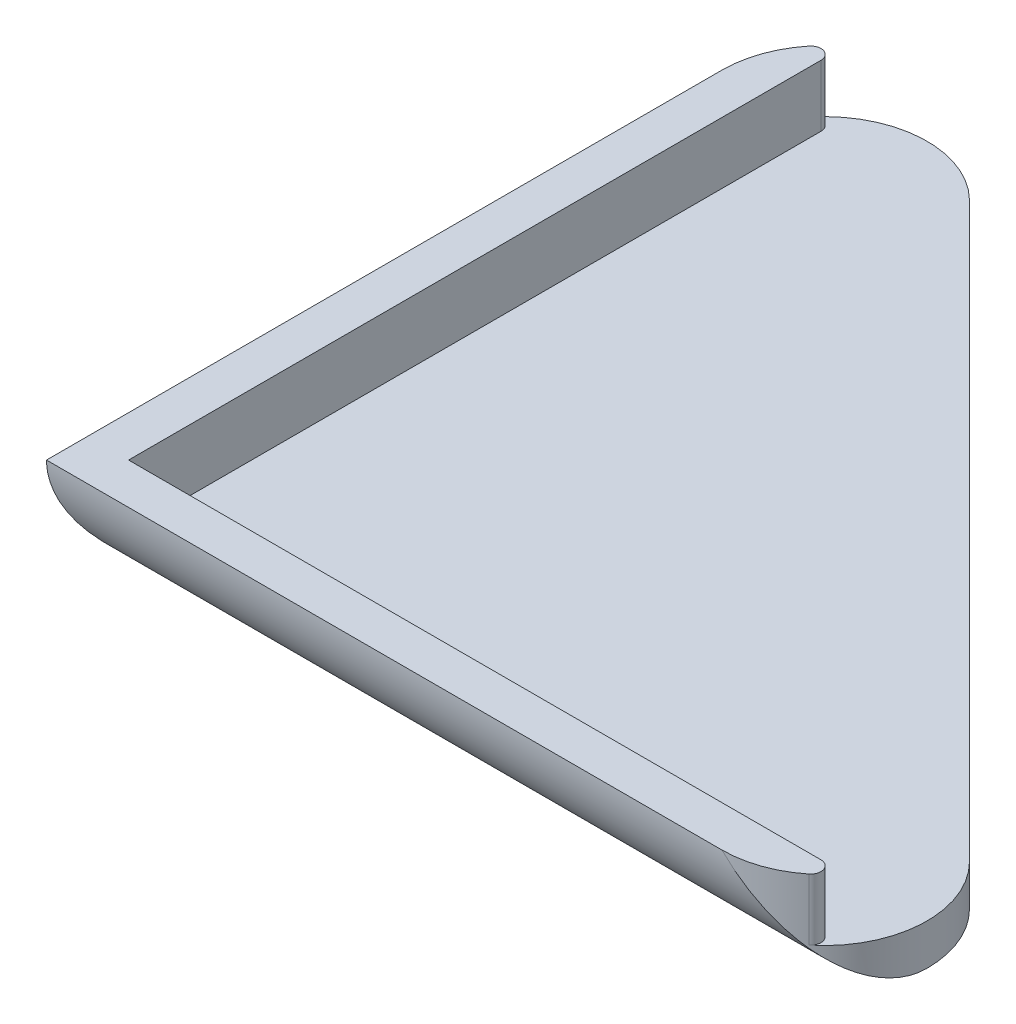
ISO-10303-21;
HEADER;
FILE_DESCRIPTION(('STEP AP214'),'2;1');
FILE_NAME('part.step','',(''),(''),'','','');
FILE_SCHEMA(('AUTOMOTIVE_DESIGN { 1 0 10303 214 1 1 1 1 }'));
ENDSEC;
DATA;
#1=APPLICATION_CONTEXT('core data for automotive mechanical design processes');
#2=APPLICATION_PROTOCOL_DEFINITION('international standard','automotive_design',2000,#1);
#3=PRODUCT_CONTEXT('',#1,'mechanical');
#4=PRODUCT('Part','Part','',(#3));
#5=PRODUCT_RELATED_PRODUCT_CATEGORY('part','',(#4));
#6=PRODUCT_DEFINITION_FORMATION('','',#4);
#7=PRODUCT_DEFINITION_CONTEXT('part definition',#1,'design');
#8=PRODUCT_DEFINITION('design','',#6,#7);
#9=PRODUCT_DEFINITION_SHAPE('','',#8);
#10=(LENGTH_UNIT() NAMED_UNIT(*) SI_UNIT(.MILLI.,.METRE.));
#11=(NAMED_UNIT(*) PLANE_ANGLE_UNIT() SI_UNIT($,.RADIAN.));
#12=(NAMED_UNIT(*) SI_UNIT($,.STERADIAN.) SOLID_ANGLE_UNIT());
#13=UNCERTAINTY_MEASURE_WITH_UNIT(LENGTH_MEASURE(1.E-05),#10,'distance_accuracy_value','');
#14=(GEOMETRIC_REPRESENTATION_CONTEXT(3) GLOBAL_UNCERTAINTY_ASSIGNED_CONTEXT((#13)) GLOBAL_UNIT_ASSIGNED_CONTEXT((#10,
#11,#12)) REPRESENTATION_CONTEXT('',''));
#15=CARTESIAN_POINT('',(0.,0.,0.));
#16=DIRECTION('',(0.,0.,1.));
#17=DIRECTION('',(1.,0.,0.));
#18=AXIS2_PLACEMENT_3D('',#15,#16,#17);
#19=CARTESIAN_POINT('',(0.,2.,0.));
#20=DIRECTION('',(0.,-1.,0.));
#21=DIRECTION('',(0.,0.,-1.));
#22=AXIS2_PLACEMENT_3D('',#19,#20,#21);
#23=PLANE('',#22);
#24=DIRECTION('',(-1.,0.,0.));
#25=VECTOR('',#24,1.);
#26=CARTESIAN_POINT('',(2.,2.,-2.));
#27=LINE('',#26,#25);
#28=CARTESIAN_POINT('',(35.7573593128807,2.,-2.));
#29=VERTEX_POINT('',#28);
#30=CARTESIAN_POINT('',(2.,2.,-2.));
#31=VERTEX_POINT('',#30);
#32=EDGE_CURVE('E142',#29,#31,#27,.T.);
#33=ORIENTED_EDGE('',*,*,#32,.F.);
#34=CARTESIAN_POINT('',(35.7573593128807,2.,-1.5));
#35=DIRECTION('',(0.,-1.,0.));
#36=DIRECTION('',(0.,0.,-1.));
#37=AXIS2_PLACEMENT_3D('',#34,#35,#36);
#38=CIRCLE('',#37,0.5);
#39=CARTESIAN_POINT('',(36.0716289934081,2.,-1.11111111111111));
#40=VERTEX_POINT('',#39);
#41=EDGE_CURVE('E11',#29,#40,#38,.T.);
#42=ORIENTED_EDGE('',*,*,#41,.T.);
#43=CARTESIAN_POINT('',(32.9289321881345,2.,-5.));
#44=DIRECTION('',(0.,-1.,0.));
#45=DIRECTION('',(0.,0.,-1.));
#46=AXIS2_PLACEMENT_3D('',#43,#44,#45);
#47=CIRCLE('',#46,5.);
#48=CARTESIAN_POINT('',(36.4644660940673,2.,-8.53553390593274));
#49=VERTEX_POINT('',#48);
#50=EDGE_CURVE('E51',#40,#49,#47,.F.);
#51=ORIENTED_EDGE('',*,*,#50,.T.);
#52=DIRECTION('',(-0.707106781186548,0.,-0.707106781186548));
#53=VECTOR('',#52,1.);
#54=CARTESIAN_POINT('',(0.,2.,-45.));
#55=LINE('',#54,#53);
#56=CARTESIAN_POINT('',(8.53553390593274,2.,-36.4644660940673));
#57=VERTEX_POINT('',#56);
#58=EDGE_CURVE('E153',#49,#57,#55,.T.);
#59=ORIENTED_EDGE('',*,*,#58,.T.);
#60=CARTESIAN_POINT('',(5.,2.,-32.9289321881345));
#61=DIRECTION('',(0.,-1.,0.));
#62=DIRECTION('',(0.,0.,-1.));
#63=AXIS2_PLACEMENT_3D('',#60,#61,#62);
#64=CIRCLE('',#63,5.);
#65=CARTESIAN_POINT('',(1.11111111111111,2.,-36.0716289934081));
#66=VERTEX_POINT('',#65);
#67=EDGE_CURVE('E172',#57,#66,#64,.F.);
#68=ORIENTED_EDGE('',*,*,#67,.T.);
#69=CARTESIAN_POINT('',(1.5,2.,-35.7573593128807));
#70=DIRECTION('',(0.,-1.,0.));
#71=DIRECTION('',(0.,0.,-1.));
#72=AXIS2_PLACEMENT_3D('',#69,#70,#71);
#73=CIRCLE('',#72,0.5);
#74=CARTESIAN_POINT('',(2.,2.,-35.7573593128807));
#75=VERTEX_POINT('',#74);
#76=EDGE_CURVE('E44',#66,#75,#73,.T.);
#77=ORIENTED_EDGE('',*,*,#76,.T.);
#78=DIRECTION('',(0.,0.,-1.));
#79=VECTOR('',#78,1.);
#80=CARTESIAN_POINT('',(2.,2.,-43.));
#81=LINE('',#80,#79);
#82=EDGE_CURVE('E139',#31,#75,#81,.T.);
#83=ORIENTED_EDGE('',*,*,#82,.F.);
#84=EDGE_LOOP('',(#33,#42,#51,#59,#68,#77,#83));
#85=FACE_BOUND('',#84,.T.);
#86=ADVANCED_FACE('F36',(#85),#23,.F.);
#87=CARTESIAN_POINT('',(0.,2.,-45.));
#88=DIRECTION('',(-0.707106781186547,0.,0.707106781186547));
#89=DIRECTION('',(0.707106781186548,0.,0.707106781186548));
#90=AXIS2_PLACEMENT_3D('',#87,#88,#89);
#91=PLANE('',#90);
#92=ORIENTED_EDGE('',*,*,#58,.F.);
#93=DIRECTION('',(0.,-1.,0.));
#94=VECTOR('',#93,1.);
#95=CARTESIAN_POINT('',(36.4644660940673,2.,-8.53553390593274));
#96=LINE('',#95,#94);
#97=CARTESIAN_POINT('',(36.4644660940673,0.,-8.53553390593274));
#98=VERTEX_POINT('',#97);
#99=EDGE_CURVE('E167',#49,#98,#96,.T.);
#100=ORIENTED_EDGE('',*,*,#99,.T.);
#101=DIRECTION('',(-0.707106781186548,0.,-0.707106781186548));
#102=VECTOR('',#101,1.);
#103=CARTESIAN_POINT('',(0.,0.,-45.));
#104=LINE('',#103,#102);
#105=CARTESIAN_POINT('',(8.53553390593274,0.,-36.4644660940673));
#106=VERTEX_POINT('',#105);
#107=EDGE_CURVE('E152',#98,#106,#104,.T.);
#108=ORIENTED_EDGE('',*,*,#107,.T.);
#109=DIRECTION('',(0.,-1.,0.));
#110=VECTOR('',#109,1.);
#111=CARTESIAN_POINT('',(8.53553390593273,2.,-36.4644660940673));
#112=LINE('',#111,#110);
#113=EDGE_CURVE('E165',#106,#57,#112,.F.);
#114=ORIENTED_EDGE('',*,*,#113,.T.);
#115=EDGE_LOOP('',(#92,#100,#108,#114));
#116=FACE_BOUND('',#115,.T.);
#117=ADVANCED_FACE('F213',(#116),#91,.F.);
#118=CARTESIAN_POINT('',(0.,0.,0.));
#119=DIRECTION('',(0.,-1.,0.));
#120=DIRECTION('',(0.,0.,-1.));
#121=AXIS2_PLACEMENT_3D('',#118,#119,#120);
#122=PLANE('',#121);
#123=ORIENTED_EDGE('',*,*,#107,.F.);
#124=CARTESIAN_POINT('',(32.9289321881345,0.,-5.));
#125=DIRECTION('',(0.,-1.,0.));
#126=DIRECTION('',(0.,0.,-1.));
#127=AXIS2_PLACEMENT_3D('',#124,#125,#126);
#128=CIRCLE('',#127,5.);
#129=CARTESIAN_POINT('',(37.9289321881345,0.,-5.));
#130=VERTEX_POINT('',#129);
#131=EDGE_CURVE('E163',#98,#130,#128,.T.);
#132=ORIENTED_EDGE('',*,*,#131,.T.);
#133=DIRECTION('',(1.,0.,0.));
#134=VECTOR('',#133,1.);
#135=CARTESIAN_POINT('',(0.,0.,-5.));
#136=LINE('',#135,#134);
#137=CARTESIAN_POINT('',(5.,0.,-5.));
#138=VERTEX_POINT('',#137);
#139=EDGE_CURVE('E161',#130,#138,#136,.F.);
#140=ORIENTED_EDGE('',*,*,#139,.T.);
#141=DIRECTION('',(0.,0.,1.));
#142=VECTOR('',#141,1.);
#143=CARTESIAN_POINT('',(5.,0.,-45.));
#144=LINE('',#143,#142);
#145=CARTESIAN_POINT('',(5.,0.,-37.9289321881345));
#146=VERTEX_POINT('',#145);
#147=EDGE_CURVE('E119',#138,#146,#144,.F.);
#148=ORIENTED_EDGE('',*,*,#147,.T.);
#149=CARTESIAN_POINT('',(5.,0.,-32.9289321881345));
#150=DIRECTION('',(0.,-1.,0.));
#151=DIRECTION('',(0.,0.,-1.));
#152=AXIS2_PLACEMENT_3D('',#149,#150,#151);
#153=CIRCLE('',#152,5.);
#154=EDGE_CURVE('E156',#146,#106,#153,.T.);
#155=ORIENTED_EDGE('',*,*,#154,.T.);
#156=EDGE_LOOP('',(#123,#132,#140,#148,#155));
#157=FACE_BOUND('',#156,.T.);
#158=ADVANCED_FACE('F209',(#157),#122,.T.);
#159=CARTESIAN_POINT('',(2.,5.,-2.));
#160=DIRECTION('',(0.,0.,1.));
#161=DIRECTION('',(1.,0.,0.));
#162=AXIS2_PLACEMENT_3D('',#159,#160,#161);
#163=PLANE('',#162);
#164=DIRECTION('',(-1.,0.,0.));
#165=VECTOR('',#164,1.);
#166=CARTESIAN_POINT('',(2.,5.,-2.));
#167=LINE('',#166,#165);
#168=CARTESIAN_POINT('',(35.7573593128807,5.,-2.));
#169=VERTEX_POINT('',#168);
#170=CARTESIAN_POINT('',(2.,5.,-2.));
#171=VERTEX_POINT('',#170);
#172=EDGE_CURVE('E132',#169,#171,#167,.T.);
#173=ORIENTED_EDGE('',*,*,#172,.F.);
#174=DIRECTION('',(0.,1.,0.));
#175=VECTOR('',#174,1.);
#176=CARTESIAN_POINT('',(35.7573593128807,2.,-2.));
#177=LINE('',#176,#175);
#178=EDGE_CURVE('E187',#169,#29,#177,.F.);
#179=ORIENTED_EDGE('',*,*,#178,.T.);
#180=ORIENTED_EDGE('',*,*,#32,.T.);
#181=DIRECTION('',(0.,-1.,0.));
#182=VECTOR('',#181,1.);
#183=CARTESIAN_POINT('',(2.,5.,-2.));
#184=LINE('',#183,#182);
#185=EDGE_CURVE('E148',#171,#31,#184,.T.);
#186=ORIENTED_EDGE('',*,*,#185,.F.);
#187=EDGE_LOOP('',(#173,#179,#180,#186));
#188=FACE_BOUND('',#187,.T.);
#189=ADVANCED_FACE('F218',(#188),#163,.F.);
#190=CARTESIAN_POINT('',(2.,5.,-43.));
#191=DIRECTION('',(-1.,0.,0.));
#192=DIRECTION('',(0.,0.,1.));
#193=AXIS2_PLACEMENT_3D('',#190,#191,#192);
#194=PLANE('',#193);
#195=ORIENTED_EDGE('',*,*,#82,.T.);
#196=DIRECTION('',(0.,1.,0.));
#197=VECTOR('',#196,1.);
#198=CARTESIAN_POINT('',(2.,5.,-35.7573593128807));
#199=LINE('',#198,#197);
#200=CARTESIAN_POINT('',(2.,5.,-35.7573593128807));
#201=VERTEX_POINT('',#200);
#202=EDGE_CURVE('E174',#75,#201,#199,.T.);
#203=ORIENTED_EDGE('',*,*,#202,.T.);
#204=DIRECTION('',(0.,0.,-1.));
#205=VECTOR('',#204,1.);
#206=CARTESIAN_POINT('',(2.,5.,-43.));
#207=LINE('',#206,#205);
#208=EDGE_CURVE('E146',#171,#201,#207,.T.);
#209=ORIENTED_EDGE('',*,*,#208,.F.);
#210=ORIENTED_EDGE('',*,*,#185,.T.);
#211=EDGE_LOOP('',(#195,#203,#209,#210));
#212=FACE_BOUND('',#211,.T.);
#213=ADVANCED_FACE('F199',(#212),#194,.F.);
#214=CARTESIAN_POINT('',(0.,5.,0.));
#215=DIRECTION('',(0.,1.,0.));
#216=DIRECTION('',(0.,0.,1.));
#217=AXIS2_PLACEMENT_3D('',#214,#215,#216);
#218=PLANE('',#217);
#219=ORIENTED_EDGE('',*,*,#208,.T.);
#220=CARTESIAN_POINT('',(1.5,5.,-35.7573593128807));
#221=DIRECTION('',(0.,1.,0.));
#222=DIRECTION('',(0.,0.,1.));
#223=AXIS2_PLACEMENT_3D('',#220,#221,#222);
#224=CIRCLE('',#223,0.5);
#225=CARTESIAN_POINT('',(1.11111111111111,5.,-36.0716289934081));
#226=VERTEX_POINT('',#225);
#227=EDGE_CURVE('E182',#201,#226,#224,.T.);
#228=ORIENTED_EDGE('',*,*,#227,.T.);
#229=CARTESIAN_POINT('',(5.,5.,-32.9289321881345));
#230=DIRECTION('',(0.,1.,0.));
#231=DIRECTION('',(0.,0.,1.));
#232=AXIS2_PLACEMENT_3D('',#229,#230,#231);
#233=CIRCLE('',#232,5.);
#234=CARTESIAN_POINT('',(0.,5.,-32.9289321881345));
#235=VERTEX_POINT('',#234);
#236=EDGE_CURVE('E137',#226,#235,#233,.T.);
#237=ORIENTED_EDGE('',*,*,#236,.T.);
#238=DIRECTION('',(0.,0.,1.));
#239=VECTOR('',#238,1.);
#240=CARTESIAN_POINT('',(0.,5.,-45.));
#241=LINE('',#240,#239);
#242=CARTESIAN_POINT('',(0.,5.,0.));
#243=VERTEX_POINT('',#242);
#244=EDGE_CURVE('E118',#235,#243,#241,.T.);
#245=ORIENTED_EDGE('',*,*,#244,.T.);
#246=DIRECTION('',(1.,0.,0.));
#247=VECTOR('',#246,1.);
#248=CARTESIAN_POINT('',(0.,5.,0.));
#249=LINE('',#248,#247);
#250=CARTESIAN_POINT('',(32.9289321881345,5.,0.));
#251=VERTEX_POINT('',#250);
#252=EDGE_CURVE('E125',#243,#251,#249,.T.);
#253=ORIENTED_EDGE('',*,*,#252,.T.);
#254=CARTESIAN_POINT('',(32.9289321881345,5.,-5.));
#255=DIRECTION('',(0.,1.,0.));
#256=DIRECTION('',(0.,0.,1.));
#257=AXIS2_PLACEMENT_3D('',#254,#255,#256);
#258=CIRCLE('',#257,5.);
#259=CARTESIAN_POINT('',(36.0716289934081,5.,-1.11111111111111));
#260=VERTEX_POINT('',#259);
#261=EDGE_CURVE('E170',#251,#260,#258,.T.);
#262=ORIENTED_EDGE('',*,*,#261,.T.);
#263=CARTESIAN_POINT('',(35.7573593128807,5.,-1.5));
#264=DIRECTION('',(0.,1.,0.));
#265=DIRECTION('',(0.,0.,1.));
#266=AXIS2_PLACEMENT_3D('',#263,#264,#265);
#267=CIRCLE('',#266,0.5);
#268=EDGE_CURVE('E180',#260,#169,#267,.T.);
#269=ORIENTED_EDGE('',*,*,#268,.T.);
#270=ORIENTED_EDGE('',*,*,#172,.T.);
#271=EDGE_LOOP('',(#219,#228,#237,#245,#253,#262,#269,#270));
#272=FACE_BOUND('',#271,.T.);
#273=ADVANCED_FACE('F135',(#272),#218,.T.);
#274=CARTESIAN_POINT('',(32.9289321881345,2.,-5.));
#275=DIRECTION('',(0.,-1.,0.));
#276=DIRECTION('',(0.,0.,-1.));
#277=AXIS2_PLACEMENT_3D('',#274,#275,#276);
#278=CYLINDRICAL_SURFACE('',#277,5.);
#279=ORIENTED_EDGE('',*,*,#50,.F.);
#280=DIRECTION('',(0.,-1.,0.));
#281=VECTOR('',#280,1.);
#282=CARTESIAN_POINT('',(36.0716289934081,2.,-1.11111111111111));
#283=LINE('',#282,#281);
#284=EDGE_CURVE('E189',#40,#260,#283,.F.);
#285=ORIENTED_EDGE('',*,*,#284,.T.);
#286=ORIENTED_EDGE('',*,*,#261,.F.);
#287=CARTESIAN_POINT('',(32.9289321881345,5.,-5.));
#288=DIRECTION('',(-0.707106781186547,-0.707106781186547,0.));
#289=DIRECTION('',(0.707106781186547,-0.707106781186547,0.));
#290=AXIS2_PLACEMENT_3D('',#287,#288,#289);
#291=ELLIPSE('',#290,7.07106781186547,5.);
#292=EDGE_CURVE('E128',#130,#251,#291,.T.);
#293=ORIENTED_EDGE('',*,*,#292,.F.);
#294=ORIENTED_EDGE('',*,*,#131,.F.);
#295=ORIENTED_EDGE('',*,*,#99,.F.);
#296=EDGE_LOOP('',(#279,#285,#286,#293,#294,#295));
#297=FACE_BOUND('',#296,.T.);
#298=ADVANCED_FACE('F214',(#297),#278,.T.);
#299=CARTESIAN_POINT('',(5.,2.,-32.9289321881345));
#300=DIRECTION('',(0.,-1.,0.));
#301=DIRECTION('',(0.,0.,-1.));
#302=AXIS2_PLACEMENT_3D('',#299,#300,#301);
#303=CYLINDRICAL_SURFACE('',#302,5.);
#304=ORIENTED_EDGE('',*,*,#236,.F.);
#305=DIRECTION('',(0.,-1.,0.));
#306=VECTOR('',#305,1.);
#307=CARTESIAN_POINT('',(1.11111111111111,2.,-36.0716289934081));
#308=LINE('',#307,#306);
#309=EDGE_CURVE('E184',#226,#66,#308,.T.);
#310=ORIENTED_EDGE('',*,*,#309,.T.);
#311=ORIENTED_EDGE('',*,*,#67,.F.);
#312=ORIENTED_EDGE('',*,*,#113,.F.);
#313=ORIENTED_EDGE('',*,*,#154,.F.);
#314=CARTESIAN_POINT('',(5.,5.,-32.9289321881345));
#315=DIRECTION('',(0.,-0.707106781186547,0.707106781186547));
#316=DIRECTION('',(0.,-0.707106781186547,-0.707106781186547));
#317=AXIS2_PLACEMENT_3D('',#314,#315,#316);
#318=ELLIPSE('',#317,7.07106781186547,5.);
#319=EDGE_CURVE('E122',#235,#146,#318,.T.);
#320=ORIENTED_EDGE('',*,*,#319,.F.);
#321=EDGE_LOOP('',(#304,#310,#311,#312,#313,#320));
#322=FACE_BOUND('',#321,.T.);
#323=ADVANCED_FACE('F204',(#322),#303,.T.);
#324=CARTESIAN_POINT('',(45.,5.,-5.));
#325=DIRECTION('',(-1.,0.,0.));
#326=DIRECTION('',(0.,0.,1.));
#327=AXIS2_PLACEMENT_3D('',#324,#325,#326);
#328=CYLINDRICAL_SURFACE('',#327,5.);
#329=ORIENTED_EDGE('',*,*,#292,.T.);
#330=ORIENTED_EDGE('',*,*,#252,.F.);
#331=CARTESIAN_POINT('',(5.,5.,-5.));
#332=DIRECTION('',(-0.707106781186547,0.,-0.707106781186547));
#333=DIRECTION('',(-0.707106781186547,0.,0.707106781186547));
#334=AXIS2_PLACEMENT_3D('',#331,#332,#333);
#335=ELLIPSE('',#334,7.07106781186547,5.);
#336=EDGE_CURVE('E113',#138,#243,#335,.T.);
#337=ORIENTED_EDGE('',*,*,#336,.F.);
#338=ORIENTED_EDGE('',*,*,#139,.F.);
#339=EDGE_LOOP('',(#329,#330,#337,#338));
#340=FACE_BOUND('',#339,.T.);
#341=ADVANCED_FACE('F126',(#340),#328,.T.);
#342=CARTESIAN_POINT('',(5.,5.,0.));
#343=DIRECTION('',(0.,0.,-1.));
#344=DIRECTION('',(-1.,0.,0.));
#345=AXIS2_PLACEMENT_3D('',#342,#343,#344);
#346=CYLINDRICAL_SURFACE('',#345,5.);
#347=ORIENTED_EDGE('',*,*,#319,.T.);
#348=ORIENTED_EDGE('',*,*,#147,.F.);
#349=ORIENTED_EDGE('',*,*,#336,.T.);
#350=ORIENTED_EDGE('',*,*,#244,.F.);
#351=EDGE_LOOP('',(#347,#348,#349,#350));
#352=FACE_BOUND('',#351,.T.);
#353=ADVANCED_FACE('F116',(#352),#346,.T.);
#354=CARTESIAN_POINT('',(1.5,2.,-35.7573593128807));
#355=DIRECTION('',(0.,-1.,0.));
#356=DIRECTION('',(0.,0.,-1.));
#357=AXIS2_PLACEMENT_3D('',#354,#355,#356);
#358=CYLINDRICAL_SURFACE('',#357,0.5);
#359=ORIENTED_EDGE('',*,*,#76,.F.);
#360=ORIENTED_EDGE('',*,*,#309,.F.);
#361=ORIENTED_EDGE('',*,*,#227,.F.);
#362=ORIENTED_EDGE('',*,*,#202,.F.);
#363=EDGE_LOOP('',(#359,#360,#361,#362));
#364=FACE_BOUND('',#363,.T.);
#365=ADVANCED_FACE('F202',(#364),#358,.T.);
#366=CARTESIAN_POINT('',(35.7573593128807,2.,-1.5));
#367=DIRECTION('',(0.,-1.,0.));
#368=DIRECTION('',(0.,0.,-1.));
#369=AXIS2_PLACEMENT_3D('',#366,#367,#368);
#370=CYLINDRICAL_SURFACE('',#369,0.5);
#371=ORIENTED_EDGE('',*,*,#268,.F.);
#372=ORIENTED_EDGE('',*,*,#284,.F.);
#373=ORIENTED_EDGE('',*,*,#41,.F.);
#374=ORIENTED_EDGE('',*,*,#178,.F.);
#375=EDGE_LOOP('',(#371,#372,#373,#374));
#376=FACE_BOUND('',#375,.T.);
#377=ADVANCED_FACE('F38',(#376),#370,.T.);
#378=CLOSED_SHELL('',(#86,#117,#158,#189,#213,#273,#298,#323,#341,#353,#365,#377));
#379=MANIFOLD_SOLID_BREP('B2',#378);
#380=ADVANCED_BREP_SHAPE_REPRESENTATION('',(#18,#379),#14);
#381=SHAPE_DEFINITION_REPRESENTATION(#9,#380);
ENDSEC;
END-ISO-10303-21;
